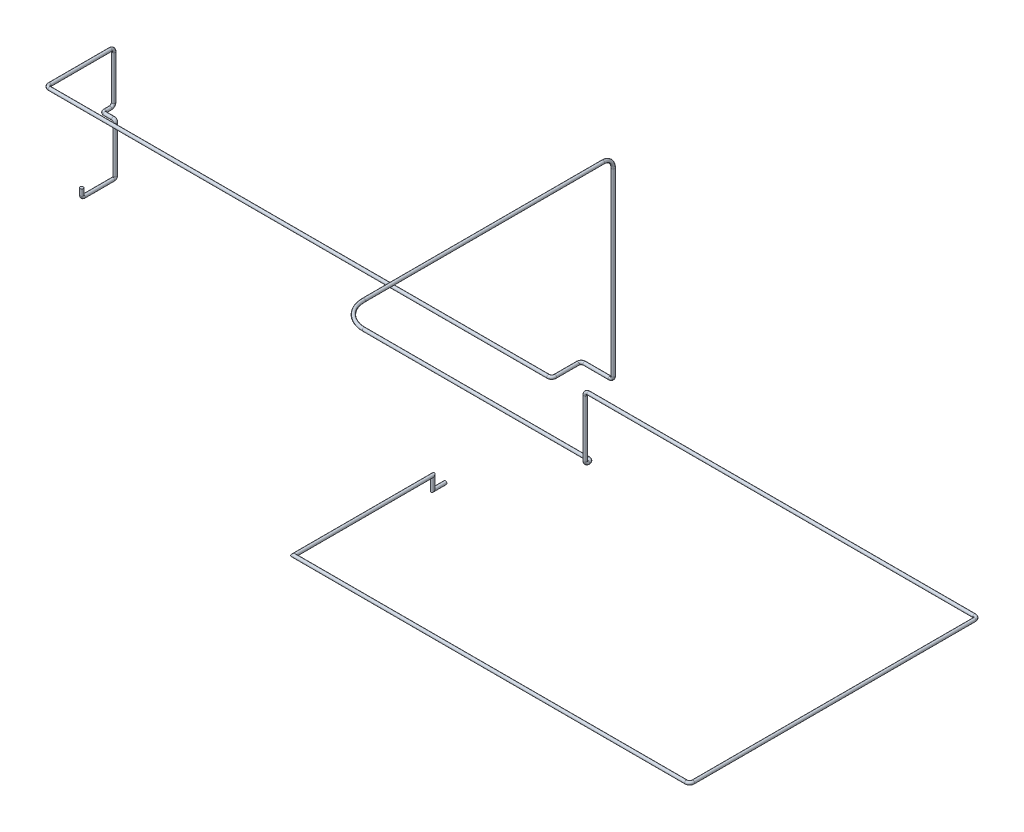
ISO-10303-21;
HEADER;
FILE_DESCRIPTION(('STEP AP214'),'2;1');
FILE_NAME('part.step','',(''),(''),'','','');
FILE_SCHEMA(('AUTOMOTIVE_DESIGN { 1 0 10303 214 1 1 1 1 }'));
ENDSEC;
DATA;
#1=APPLICATION_CONTEXT('core data for automotive mechanical design processes');
#2=APPLICATION_PROTOCOL_DEFINITION('international standard','automotive_design',2000,#1);
#3=PRODUCT_CONTEXT('',#1,'mechanical');
#4=PRODUCT('Part','Part','',(#3));
#5=PRODUCT_RELATED_PRODUCT_CATEGORY('part','',(#4));
#6=PRODUCT_DEFINITION_FORMATION('','',#4);
#7=PRODUCT_DEFINITION_CONTEXT('part definition',#1,'design');
#8=PRODUCT_DEFINITION('design','',#6,#7);
#9=PRODUCT_DEFINITION_SHAPE('','',#8);
#10=(LENGTH_UNIT() NAMED_UNIT(*) SI_UNIT(.MILLI.,.METRE.));
#11=(NAMED_UNIT(*) PLANE_ANGLE_UNIT() SI_UNIT($,.RADIAN.));
#12=(NAMED_UNIT(*) SI_UNIT($,.STERADIAN.) SOLID_ANGLE_UNIT());
#13=UNCERTAINTY_MEASURE_WITH_UNIT(LENGTH_MEASURE(1.E-05),#10,'distance_accuracy_value','');
#14=(GEOMETRIC_REPRESENTATION_CONTEXT(3) GLOBAL_UNCERTAINTY_ASSIGNED_CONTEXT((#13)) GLOBAL_UNIT_ASSIGNED_CONTEXT((#10,
#11,#12)) REPRESENTATION_CONTEXT('',''));
#15=CARTESIAN_POINT('',(0.,0.,0.));
#16=DIRECTION('',(0.,0.,1.));
#17=DIRECTION('',(1.,0.,0.));
#18=AXIS2_PLACEMENT_3D('',#15,#16,#17);
#19=CARTESIAN_POINT('',(0.,0.,-10.));
#20=DIRECTION('',(0.,0.,1.));
#21=DIRECTION('',(1.,0.,0.));
#22=AXIS2_PLACEMENT_3D('',#19,#20,#21);
#23=CYLINDRICAL_SURFACE('',#22,19.05);
#24=CARTESIAN_POINT('',(0.,0.,-30.));
#25=DIRECTION('',(0.,0.,-1.));
#26=DIRECTION('',(-1.,0.,0.));
#27=AXIS2_PLACEMENT_3D('',#24,#25,#26);
#28=CIRCLE('',#27,19.05);
#29=CARTESIAN_POINT('',(0.,-19.05,-30.));
#30=VERTEX_POINT('',#29);
#31=EDGE_CURVE('E11',#30,#30,#28,.T.);
#32=ORIENTED_EDGE('',*,*,#31,.F.);
#33=EDGE_LOOP('',(#32));
#34=FACE_BOUND('',#33,.T.);
#35=CARTESIAN_POINT('',(0.,0.,35.));
#36=DIRECTION('',(0.,0.,1.));
#37=DIRECTION('',(1.,0.,0.));
#38=AXIS2_PLACEMENT_3D('',#35,#36,#37);
#39=CIRCLE('',#38,19.05);
#40=CARTESIAN_POINT('',(-19.05,0.,35.));
#41=VERTEX_POINT('',#40);
#42=EDGE_CURVE('E323',#41,#41,#39,.T.);
#43=ORIENTED_EDGE('',*,*,#42,.F.);
#44=EDGE_LOOP('',(#43));
#45=FACE_BOUND('',#44,.T.);
#46=ADVANCED_FACE('F35',(#34,#45),#23,.T.);
#47=CARTESIAN_POINT('',(9340.,3500.,5332.));
#48=DIRECTION('',(0.,0.,-1.));
#49=DIRECTION('',(1.,0.,0.));
#50=AXIS2_PLACEMENT_3D('',#47,#48,#49);
#51=PLANE('',#50);
#52=CARTESIAN_POINT('',(9340.,3500.,5332.));
#53=DIRECTION('',(0.,0.,-1.));
#54=DIRECTION('',(1.,0.,0.));
#55=AXIS2_PLACEMENT_3D('',#52,#53,#54);
#56=CIRCLE('',#55,19.05);
#57=CARTESIAN_POINT('',(9359.05,3500.,5332.));
#58=VERTEX_POINT('',#57);
#59=EDGE_CURVE('E38',#58,#58,#56,.T.);
#60=ORIENTED_EDGE('',*,*,#59,.T.);
#61=EDGE_LOOP('',(#60));
#62=FACE_BOUND('',#61,.T.);
#63=ADVANCED_FACE('F167',(#62),#51,.T.);
#64=CARTESIAN_POINT('',(9340.,3500.,5524.01));
#65=DIRECTION('',(0.,0.,-1.));
#66=DIRECTION('',(-1.,0.,0.));
#67=AXIS2_PLACEMENT_3D('',#64,#65,#66);
#68=CYLINDRICAL_SURFACE('',#67,19.05);
#69=CARTESIAN_POINT('',(9340.,3500.,5482.));
#70=DIRECTION('',(0.,-0.707106781186547,-0.707106781186547));
#71=DIRECTION('',(0.,-0.707106781186548,0.707106781186548));
#72=AXIS2_PLACEMENT_3D('',#69,#70,#71);
#73=ELLIPSE('',#72,26.9407683632075,19.05);
#74=CARTESIAN_POINT('',(9340.,3480.95,5501.05));
#75=VERTEX_POINT('',#74);
#76=EDGE_CURVE('E53',#75,#75,#73,.F.);
#77=ORIENTED_EDGE('',*,*,#76,.F.);
#78=EDGE_LOOP('',(#77));
#79=FACE_BOUND('',#78,.T.);
#80=ORIENTED_EDGE('',*,*,#59,.F.);
#81=EDGE_LOOP('',(#80));
#82=FACE_BOUND('',#81,.T.);
#83=ADVANCED_FACE('F157',(#79,#82),#68,.T.);
#84=CARTESIAN_POINT('',(9340.,3692.01,5482.));
#85=DIRECTION('',(0.,-1.,0.));
#86=DIRECTION('',(0.,0.,-1.));
#87=AXIS2_PLACEMENT_3D('',#84,#85,#86);
#88=CYLINDRICAL_SURFACE('',#87,19.05);
#89=CARTESIAN_POINT('',(9340.,3650.,5482.));
#90=DIRECTION('',(0.,-0.707106781186548,-0.707106781186548));
#91=DIRECTION('',(0.,0.707106781186548,-0.707106781186548));
#92=AXIS2_PLACEMENT_3D('',#89,#90,#91);
#93=ELLIPSE('',#92,26.9407683632075,19.05);
#94=CARTESIAN_POINT('',(9340.,3669.05,5462.95));
#95=VERTEX_POINT('',#94);
#96=EDGE_CURVE('E151',#95,#95,#93,.F.);
#97=ORIENTED_EDGE('',*,*,#96,.F.);
#98=EDGE_LOOP('',(#97));
#99=FACE_BOUND('',#98,.T.);
#100=ORIENTED_EDGE('',*,*,#76,.T.);
#101=EDGE_LOOP('',(#100));
#102=FACE_BOUND('',#101,.T.);
#103=ADVANCED_FACE('F154',(#99,#102),#88,.T.);
#104=CARTESIAN_POINT('',(9340.,3650.,7153.055));
#105=DIRECTION('',(0.,0.,-1.));
#106=DIRECTION('',(-1.,0.,0.));
#107=AXIS2_PLACEMENT_3D('',#104,#105,#106);
#108=CYLINDRICAL_SURFACE('',#107,19.05);
#109=CARTESIAN_POINT('',(9340.,3650.,7132.));
#110=DIRECTION('',(-0.707106781186548,0.,-0.707106781186548));
#111=DIRECTION('',(-0.707106781186548,0.,0.707106781186548));
#112=AXIS2_PLACEMENT_3D('',#109,#110,#111);
#113=ELLIPSE('',#112,26.9407683632075,19.05);
#114=CARTESIAN_POINT('',(9320.95,3650.,7151.05));
#115=VERTEX_POINT('',#114);
#116=EDGE_CURVE('E78',#115,#115,#113,.F.);
#117=ORIENTED_EDGE('',*,*,#116,.F.);
#118=EDGE_LOOP('',(#117));
#119=FACE_BOUND('',#118,.T.);
#120=ORIENTED_EDGE('',*,*,#96,.T.);
#121=EDGE_LOOP('',(#120));
#122=FACE_BOUND('',#121,.T.);
#123=ADVANCED_FACE('F156',(#119,#122),#108,.T.);
#124=CARTESIAN_POINT('',(0.,40.,-30.));
#125=DIRECTION('',(1.,0.,0.));
#126=DIRECTION('',(0.,0.,-1.));
#127=AXIS2_PLACEMENT_3D('',#124,#125,#126);
#128=TOROIDAL_SURFACE('',#127,40.,19.05);
#129=CARTESIAN_POINT('',(0.,40.,-70.));
#130=DIRECTION('',(0.,1.,0.));
#131=DIRECTION('',(-1.,0.,0.));
#132=AXIS2_PLACEMENT_3D('',#129,#130,#131);
#133=CIRCLE('',#132,19.05);
#134=CARTESIAN_POINT('',(0.,40.,-89.05));
#135=VERTEX_POINT('',#134);
#136=EDGE_CURVE('E43',#135,#135,#133,.T.);
#137=CARTESIAN_POINT('',(0.,40.,-30.));
#138=DIRECTION('',(1.,0.,0.));
#139=DIRECTION('',(0.,0.,-1.));
#140=AXIS2_PLACEMENT_3D('',#137,#138,#139);
#141=CIRCLE('',#140,59.05);
#142=EDGE_CURVE('',#30,#135,#141,.T.);
#143=ORIENTED_EDGE('',*,*,#31,.T.);
#144=ORIENTED_EDGE('',*,*,#136,.F.);
#145=ORIENTED_EDGE('',*,*,#142,.T.);
#146=ORIENTED_EDGE('',*,*,#142,.F.);
#147=EDGE_LOOP('',(#143,#145,#144,#146));
#148=FACE_BOUND('',#147,.T.);
#149=ADVANCED_FACE('F164',(#148),#128,.T.);
#150=CARTESIAN_POINT('',(0.,40.,-70.));
#151=DIRECTION('',(0.,1.,0.));
#152=DIRECTION('',(0.,0.,1.));
#153=AXIS2_PLACEMENT_3D('',#150,#151,#152);
#154=CYLINDRICAL_SURFACE('',#153,19.05);
#155=CARTESIAN_POINT('',(0.,560.,-70.));
#156=DIRECTION('',(0.,1.,0.));
#157=DIRECTION('',(-1.,0.,0.));
#158=AXIS2_PLACEMENT_3D('',#155,#156,#157);
#159=CIRCLE('',#158,19.05);
#160=CARTESIAN_POINT('',(0.,560.,-89.05));
#161=VERTEX_POINT('',#160);
#162=EDGE_CURVE('E144',#161,#161,#159,.T.);
#163=ORIENTED_EDGE('',*,*,#162,.F.);
#164=EDGE_LOOP('',(#163));
#165=FACE_BOUND('',#164,.T.);
#166=ORIENTED_EDGE('',*,*,#136,.T.);
#167=EDGE_LOOP('',(#166));
#168=FACE_BOUND('',#167,.T.);
#169=ADVANCED_FACE('F195',(#165,#168),#154,.T.);
#170=CARTESIAN_POINT('',(0.,560.,-30.));
#171=DIRECTION('',(1.,0.,0.));
#172=DIRECTION('',(0.,0.,-1.));
#173=AXIS2_PLACEMENT_3D('',#170,#171,#172);
#174=TOROIDAL_SURFACE('',#173,40.,19.05);
#175=CARTESIAN_POINT('',(0.,600.,-30.));
#176=DIRECTION('',(0.,0.,1.));
#177=DIRECTION('',(-1.,0.,0.));
#178=AXIS2_PLACEMENT_3D('',#175,#176,#177);
#179=CIRCLE('',#178,19.05);
#180=CARTESIAN_POINT('',(0.,619.05,-30.));
#181=VERTEX_POINT('',#180);
#182=EDGE_CURVE('E141',#181,#181,#179,.T.);
#183=CARTESIAN_POINT('',(0.,560.,-30.));
#184=DIRECTION('',(1.,0.,0.));
#185=DIRECTION('',(0.,0.,-1.));
#186=AXIS2_PLACEMENT_3D('',#183,#184,#185);
#187=CIRCLE('',#186,59.05);
#188=EDGE_CURVE('',#161,#181,#187,.T.);
#189=ORIENTED_EDGE('',*,*,#162,.T.);
#190=ORIENTED_EDGE('',*,*,#182,.F.);
#191=ORIENTED_EDGE('',*,*,#188,.T.);
#192=ORIENTED_EDGE('',*,*,#188,.F.);
#193=EDGE_LOOP('',(#189,#191,#190,#192));
#194=FACE_BOUND('',#193,.T.);
#195=ADVANCED_FACE('F199',(#194),#174,.T.);
#196=CARTESIAN_POINT('',(0.,600.,-30.));
#197=DIRECTION('',(0.,0.,1.));
#198=DIRECTION('',(1.,0.,0.));
#199=AXIS2_PLACEMENT_3D('',#196,#197,#198);
#200=CYLINDRICAL_SURFACE('',#199,19.05);
#201=CARTESIAN_POINT('',(0.,600.,690.));
#202=DIRECTION('',(0.,0.,1.));
#203=DIRECTION('',(-1.,0.,0.));
#204=AXIS2_PLACEMENT_3D('',#201,#202,#203);
#205=CIRCLE('',#204,19.05);
#206=CARTESIAN_POINT('',(-19.05,600.,690.));
#207=VERTEX_POINT('',#206);
#208=EDGE_CURVE('E138',#207,#207,#205,.T.);
#209=ORIENTED_EDGE('',*,*,#208,.F.);
#210=EDGE_LOOP('',(#209));
#211=FACE_BOUND('',#210,.T.);
#212=ORIENTED_EDGE('',*,*,#182,.T.);
#213=EDGE_LOOP('',(#212));
#214=FACE_BOUND('',#213,.T.);
#215=ADVANCED_FACE('F203',(#211,#214),#200,.T.);
#216=CARTESIAN_POINT('',(40.,600.,690.));
#217=DIRECTION('',(0.,1.,0.));
#218=DIRECTION('',(0.,0.,1.));
#219=AXIS2_PLACEMENT_3D('',#216,#217,#218);
#220=TOROIDAL_SURFACE('',#219,40.,19.05);
#221=CARTESIAN_POINT('',(40.,600.,730.));
#222=DIRECTION('',(1.,0.,0.));
#223=DIRECTION('',(0.,0.,1.));
#224=AXIS2_PLACEMENT_3D('',#221,#222,#223);
#225=CIRCLE('',#224,19.05);
#226=CARTESIAN_POINT('',(40.,600.,749.05));
#227=VERTEX_POINT('',#226);
#228=EDGE_CURVE('E135',#227,#227,#225,.T.);
#229=CARTESIAN_POINT('',(40.,600.,690.));
#230=DIRECTION('',(0.,1.,0.));
#231=DIRECTION('',(0.,0.,1.));
#232=AXIS2_PLACEMENT_3D('',#229,#230,#231);
#233=CIRCLE('',#232,59.05);
#234=EDGE_CURVE('',#207,#227,#233,.T.);
#235=ORIENTED_EDGE('',*,*,#208,.T.);
#236=ORIENTED_EDGE('',*,*,#228,.F.);
#237=ORIENTED_EDGE('',*,*,#234,.T.);
#238=ORIENTED_EDGE('',*,*,#234,.F.);
#239=EDGE_LOOP('',(#235,#237,#236,#238));
#240=FACE_BOUND('',#239,.T.);
#241=ADVANCED_FACE('F207',(#240),#220,.T.);
#242=CARTESIAN_POINT('',(40.,600.,730.));
#243=DIRECTION('',(1.,0.,0.));
#244=DIRECTION('',(0.,0.,-1.));
#245=AXIS2_PLACEMENT_3D('',#242,#243,#244);
#246=CYLINDRICAL_SURFACE('',#245,19.05);
#247=CARTESIAN_POINT('',(5960.,600.,730.));
#248=DIRECTION('',(1.,0.,0.));
#249=DIRECTION('',(0.,0.,1.));
#250=AXIS2_PLACEMENT_3D('',#247,#248,#249);
#251=CIRCLE('',#250,19.05);
#252=CARTESIAN_POINT('',(5960.,600.,749.05));
#253=VERTEX_POINT('',#252);
#254=EDGE_CURVE('E132',#253,#253,#251,.T.);
#255=ORIENTED_EDGE('',*,*,#254,.F.);
#256=EDGE_LOOP('',(#255));
#257=FACE_BOUND('',#256,.T.);
#258=ORIENTED_EDGE('',*,*,#228,.T.);
#259=EDGE_LOOP('',(#258));
#260=FACE_BOUND('',#259,.T.);
#261=ADVANCED_FACE('F211',(#257,#260),#246,.T.);
#262=CARTESIAN_POINT('',(5960.,600.,690.));
#263=DIRECTION('',(0.,1.,0.));
#264=DIRECTION('',(0.,0.,1.));
#265=AXIS2_PLACEMENT_3D('',#262,#263,#264);
#266=TOROIDAL_SURFACE('',#265,40.,19.05);
#267=CARTESIAN_POINT('',(6000.,600.,690.));
#268=DIRECTION('',(0.,0.,-1.));
#269=DIRECTION('',(1.,0.,0.));
#270=AXIS2_PLACEMENT_3D('',#267,#268,#269);
#271=CIRCLE('',#270,19.05);
#272=CARTESIAN_POINT('',(6019.05,600.,690.));
#273=VERTEX_POINT('',#272);
#274=EDGE_CURVE('E129',#273,#273,#271,.T.);
#275=CARTESIAN_POINT('',(5960.,600.,690.));
#276=DIRECTION('',(0.,1.,0.));
#277=DIRECTION('',(0.,0.,1.));
#278=AXIS2_PLACEMENT_3D('',#275,#276,#277);
#279=CIRCLE('',#278,59.05);
#280=EDGE_CURVE('',#253,#273,#279,.T.);
#281=ORIENTED_EDGE('',*,*,#254,.T.);
#282=ORIENTED_EDGE('',*,*,#274,.F.);
#283=ORIENTED_EDGE('',*,*,#280,.T.);
#284=ORIENTED_EDGE('',*,*,#280,.F.);
#285=EDGE_LOOP('',(#281,#283,#282,#284));
#286=FACE_BOUND('',#285,.T.);
#287=ADVANCED_FACE('F215',(#286),#266,.T.);
#288=CARTESIAN_POINT('',(6000.,600.,690.));
#289=DIRECTION('',(0.,0.,-1.));
#290=DIRECTION('',(-1.,0.,0.));
#291=AXIS2_PLACEMENT_3D('',#288,#289,#290);
#292=CYLINDRICAL_SURFACE('',#291,19.05);
#293=CARTESIAN_POINT('',(6000.,600.,420.));
#294=DIRECTION('',(0.,0.,-1.));
#295=DIRECTION('',(1.,0.,0.));
#296=AXIS2_PLACEMENT_3D('',#293,#294,#295);
#297=CIRCLE('',#296,19.05);
#298=CARTESIAN_POINT('',(5980.95,600.,420.));
#299=VERTEX_POINT('',#298);
#300=EDGE_CURVE('E126',#299,#299,#297,.T.);
#301=ORIENTED_EDGE('',*,*,#300,.F.);
#302=EDGE_LOOP('',(#301));
#303=FACE_BOUND('',#302,.T.);
#304=ORIENTED_EDGE('',*,*,#274,.T.);
#305=EDGE_LOOP('',(#304));
#306=FACE_BOUND('',#305,.T.);
#307=ADVANCED_FACE('F219',(#303,#306),#292,.T.);
#308=CARTESIAN_POINT('',(6040.,600.,420.));
#309=DIRECTION('',(0.,-1.,0.));
#310=DIRECTION('',(0.,0.,-1.));
#311=AXIS2_PLACEMENT_3D('',#308,#309,#310);
#312=TOROIDAL_SURFACE('',#311,40.,19.05);
#313=CARTESIAN_POINT('',(6040.,600.,380.));
#314=DIRECTION('',(1.,0.,0.));
#315=DIRECTION('',(0.,0.,1.));
#316=AXIS2_PLACEMENT_3D('',#313,#314,#315);
#317=CIRCLE('',#316,19.05);
#318=CARTESIAN_POINT('',(6040.,600.,360.95));
#319=VERTEX_POINT('',#318);
#320=EDGE_CURVE('E123',#319,#319,#317,.T.);
#321=CARTESIAN_POINT('',(6040.,600.,420.));
#322=DIRECTION('',(0.,-1.,0.));
#323=DIRECTION('',(0.,0.,-1.));
#324=AXIS2_PLACEMENT_3D('',#321,#322,#323);
#325=CIRCLE('',#324,59.05);
#326=EDGE_CURVE('',#299,#319,#325,.T.);
#327=ORIENTED_EDGE('',*,*,#300,.T.);
#328=ORIENTED_EDGE('',*,*,#320,.F.);
#329=ORIENTED_EDGE('',*,*,#326,.T.);
#330=ORIENTED_EDGE('',*,*,#326,.F.);
#331=EDGE_LOOP('',(#327,#329,#328,#330));
#332=FACE_BOUND('',#331,.T.);
#333=ADVANCED_FACE('F223',(#332),#312,.T.);
#334=CARTESIAN_POINT('',(6040.,600.,380.));
#335=DIRECTION('',(1.,0.,0.));
#336=DIRECTION('',(0.,0.,-1.));
#337=AXIS2_PLACEMENT_3D('',#334,#335,#336);
#338=CYLINDRICAL_SURFACE('',#337,19.05);
#339=CARTESIAN_POINT('',(6340.,600.,380.));
#340=DIRECTION('',(1.,0.,0.));
#341=DIRECTION('',(0.,0.,1.));
#342=AXIS2_PLACEMENT_3D('',#339,#340,#341);
#343=CIRCLE('',#342,19.05);
#344=CARTESIAN_POINT('',(6340.,580.95,380.));
#345=VERTEX_POINT('',#344);
#346=EDGE_CURVE('E120',#345,#345,#343,.T.);
#347=ORIENTED_EDGE('',*,*,#346,.F.);
#348=EDGE_LOOP('',(#347));
#349=FACE_BOUND('',#348,.T.);
#350=ORIENTED_EDGE('',*,*,#320,.T.);
#351=EDGE_LOOP('',(#350));
#352=FACE_BOUND('',#351,.T.);
#353=ADVANCED_FACE('F227',(#349,#352),#338,.T.);
#354=CARTESIAN_POINT('',(6340.,640.,380.));
#355=DIRECTION('',(0.,0.,1.));
#356=DIRECTION('',(1.,0.,0.));
#357=AXIS2_PLACEMENT_3D('',#354,#355,#356);
#358=TOROIDAL_SURFACE('',#357,40.,19.05);
#359=CARTESIAN_POINT('',(6380.,640.,380.));
#360=DIRECTION('',(0.,1.,0.));
#361=DIRECTION('',(0.,0.,1.));
#362=AXIS2_PLACEMENT_3D('',#359,#360,#361);
#363=CIRCLE('',#362,19.05);
#364=CARTESIAN_POINT('',(6399.05,640.,380.));
#365=VERTEX_POINT('',#364);
#366=EDGE_CURVE('E117',#365,#365,#363,.T.);
#367=CARTESIAN_POINT('',(6340.,640.,380.));
#368=DIRECTION('',(0.,0.,1.));
#369=DIRECTION('',(1.,0.,0.));
#370=AXIS2_PLACEMENT_3D('',#367,#368,#369);
#371=CIRCLE('',#370,59.05);
#372=EDGE_CURVE('',#345,#365,#371,.T.);
#373=ORIENTED_EDGE('',*,*,#346,.T.);
#374=ORIENTED_EDGE('',*,*,#366,.F.);
#375=ORIENTED_EDGE('',*,*,#372,.T.);
#376=ORIENTED_EDGE('',*,*,#372,.F.);
#377=EDGE_LOOP('',(#373,#375,#374,#376));
#378=FACE_BOUND('',#377,.T.);
#379=ADVANCED_FACE('F231',(#378),#358,.T.);
#380=CARTESIAN_POINT('',(6380.,640.,380.));
#381=DIRECTION('',(0.,1.,0.));
#382=DIRECTION('',(0.,0.,1.));
#383=AXIS2_PLACEMENT_3D('',#380,#381,#382);
#384=CYLINDRICAL_SURFACE('',#383,19.05);
#385=CARTESIAN_POINT('',(6380.,2780.,380.));
#386=DIRECTION('',(0.,1.,0.));
#387=DIRECTION('',(0.,0.,1.));
#388=AXIS2_PLACEMENT_3D('',#385,#386,#387);
#389=CIRCLE('',#388,19.05);
#390=CARTESIAN_POINT('',(6380.,2780.,360.95));
#391=VERTEX_POINT('',#390);
#392=EDGE_CURVE('E114',#391,#391,#389,.T.);
#393=ORIENTED_EDGE('',*,*,#392,.F.);
#394=EDGE_LOOP('',(#393));
#395=FACE_BOUND('',#394,.T.);
#396=ORIENTED_EDGE('',*,*,#366,.T.);
#397=EDGE_LOOP('',(#396));
#398=FACE_BOUND('',#397,.T.);
#399=ADVANCED_FACE('F235',(#395,#398),#384,.T.);
#400=CARTESIAN_POINT('',(6380.,2780.,500.));
#401=DIRECTION('',(1.,0.,0.));
#402=DIRECTION('',(0.,0.,-1.));
#403=AXIS2_PLACEMENT_3D('',#400,#401,#402);
#404=TOROIDAL_SURFACE('',#403,120.,19.05);
#405=CARTESIAN_POINT('',(6380.,2900.,500.));
#406=DIRECTION('',(0.,0.,1.));
#407=DIRECTION('',(0.,-1.,0.));
#408=AXIS2_PLACEMENT_3D('',#405,#406,#407);
#409=CIRCLE('',#408,19.05);
#410=CARTESIAN_POINT('',(6380.,2919.05,500.));
#411=VERTEX_POINT('',#410);
#412=EDGE_CURVE('E111',#411,#411,#409,.T.);
#413=CARTESIAN_POINT('',(6380.,2780.,500.));
#414=DIRECTION('',(1.,0.,0.));
#415=DIRECTION('',(0.,0.,-1.));
#416=AXIS2_PLACEMENT_3D('',#413,#414,#415);
#417=CIRCLE('',#416,139.05);
#418=EDGE_CURVE('',#391,#411,#417,.T.);
#419=ORIENTED_EDGE('',*,*,#392,.T.);
#420=ORIENTED_EDGE('',*,*,#412,.F.);
#421=ORIENTED_EDGE('',*,*,#418,.T.);
#422=ORIENTED_EDGE('',*,*,#418,.F.);
#423=EDGE_LOOP('',(#419,#421,#420,#422));
#424=FACE_BOUND('',#423,.T.);
#425=ADVANCED_FACE('F239',(#424),#404,.T.);
#426=CARTESIAN_POINT('',(6380.,2900.,500.));
#427=DIRECTION('',(0.,0.,1.));
#428=DIRECTION('',(1.,0.,0.));
#429=AXIS2_PLACEMENT_3D('',#426,#427,#428);
#430=CYLINDRICAL_SURFACE('',#429,19.05);
#431=CARTESIAN_POINT('',(6380.,2900.,3340.));
#432=DIRECTION('',(0.,0.,1.));
#433=DIRECTION('',(0.,-1.,0.));
#434=AXIS2_PLACEMENT_3D('',#431,#432,#433);
#435=CIRCLE('',#434,19.05);
#436=CARTESIAN_POINT('',(6360.95,2900.,3340.));
#437=VERTEX_POINT('',#436);
#438=EDGE_CURVE('E108',#437,#437,#435,.T.);
#439=ORIENTED_EDGE('',*,*,#438,.F.);
#440=EDGE_LOOP('',(#439));
#441=FACE_BOUND('',#440,.T.);
#442=ORIENTED_EDGE('',*,*,#412,.T.);
#443=EDGE_LOOP('',(#442));
#444=FACE_BOUND('',#443,.T.);
#445=ADVANCED_FACE('F243',(#441,#444),#430,.T.);
#446=CARTESIAN_POINT('',(6680.,2900.,3340.));
#447=DIRECTION('',(0.,1.,0.));
#448=DIRECTION('',(0.,0.,1.));
#449=AXIS2_PLACEMENT_3D('',#446,#447,#448);
#450=TOROIDAL_SURFACE('',#449,300.,19.05);
#451=CARTESIAN_POINT('',(6680.,2900.,3640.));
#452=DIRECTION('',(1.,0.,0.));
#453=DIRECTION('',(0.,-1.,0.));
#454=AXIS2_PLACEMENT_3D('',#451,#452,#453);
#455=CIRCLE('',#454,19.05);
#456=CARTESIAN_POINT('',(6680.,2900.,3659.05));
#457=VERTEX_POINT('',#456);
#458=EDGE_CURVE('E105',#457,#457,#455,.T.);
#459=CARTESIAN_POINT('',(6680.,2900.,3340.));
#460=DIRECTION('',(0.,1.,0.));
#461=DIRECTION('',(0.,0.,1.));
#462=AXIS2_PLACEMENT_3D('',#459,#460,#461);
#463=CIRCLE('',#462,319.05);
#464=EDGE_CURVE('',#437,#457,#463,.T.);
#465=ORIENTED_EDGE('',*,*,#438,.T.);
#466=ORIENTED_EDGE('',*,*,#458,.F.);
#467=ORIENTED_EDGE('',*,*,#464,.T.);
#468=ORIENTED_EDGE('',*,*,#464,.F.);
#469=EDGE_LOOP('',(#465,#467,#466,#468));
#470=FACE_BOUND('',#469,.T.);
#471=ADVANCED_FACE('F247',(#470),#450,.T.);
#472=CARTESIAN_POINT('',(6680.,2900.,3640.));
#473=DIRECTION('',(1.,0.,0.));
#474=DIRECTION('',(0.,0.,-1.));
#475=AXIS2_PLACEMENT_3D('',#472,#473,#474);
#476=CYLINDRICAL_SURFACE('',#475,19.05);
#477=CARTESIAN_POINT('',(9345.,2900.,3640.));
#478=DIRECTION('',(1.,0.,0.));
#479=DIRECTION('',(0.,-1.,0.));
#480=AXIS2_PLACEMENT_3D('',#477,#478,#479);
#481=CIRCLE('',#480,19.05);
#482=CARTESIAN_POINT('',(9345.,2900.,3620.95));
#483=VERTEX_POINT('',#482);
#484=EDGE_CURVE('E102',#483,#483,#481,.T.);
#485=ORIENTED_EDGE('',*,*,#484,.F.);
#486=EDGE_LOOP('',(#485));
#487=FACE_BOUND('',#486,.T.);
#488=ORIENTED_EDGE('',*,*,#458,.T.);
#489=EDGE_LOOP('',(#488));
#490=FACE_BOUND('',#489,.T.);
#491=ADVANCED_FACE('F251',(#487,#490),#476,.T.);
#492=CARTESIAN_POINT('',(9345.,2900.,3675.));
#493=DIRECTION('',(0.,-1.,0.));
#494=DIRECTION('',(0.,0.,-1.));
#495=AXIS2_PLACEMENT_3D('',#492,#493,#494);
#496=TOROIDAL_SURFACE('',#495,35.0000000000001,19.05);
#497=CARTESIAN_POINT('',(9380.,2900.,3675.));
#498=DIRECTION('',(0.,0.,1.));
#499=DIRECTION('',(0.,-1.,0.));
#500=AXIS2_PLACEMENT_3D('',#497,#498,#499);
#501=CIRCLE('',#500,19.05);
#502=CARTESIAN_POINT('',(9399.05,2900.,3675.));
#503=VERTEX_POINT('',#502);
#504=EDGE_CURVE('E99',#503,#503,#501,.T.);
#505=CARTESIAN_POINT('',(9345.,2900.,3675.));
#506=DIRECTION('',(0.,-1.,0.));
#507=DIRECTION('',(0.,0.,-1.));
#508=AXIS2_PLACEMENT_3D('',#505,#506,#507);
#509=CIRCLE('',#508,54.0500000000001);
#510=EDGE_CURVE('',#483,#503,#509,.T.);
#511=ORIENTED_EDGE('',*,*,#484,.T.);
#512=ORIENTED_EDGE('',*,*,#504,.F.);
#513=ORIENTED_EDGE('',*,*,#510,.T.);
#514=ORIENTED_EDGE('',*,*,#510,.F.);
#515=EDGE_LOOP('',(#511,#513,#512,#514));
#516=FACE_BOUND('',#515,.T.);
#517=ADVANCED_FACE('F255',(#516),#496,.T.);
#518=CARTESIAN_POINT('',(9380.,2900.,3675.));
#519=DIRECTION('',(0.,0.,1.));
#520=DIRECTION('',(1.,0.,0.));
#521=AXIS2_PLACEMENT_3D('',#518,#519,#520);
#522=CYLINDRICAL_SURFACE('',#521,19.05);
#523=CARTESIAN_POINT('',(9380.,2900.,3677.));
#524=DIRECTION('',(0.,0.,1.));
#525=DIRECTION('',(0.,-1.,0.));
#526=AXIS2_PLACEMENT_3D('',#523,#524,#525);
#527=CIRCLE('',#526,19.05);
#528=CARTESIAN_POINT('',(9380.,2880.95,3677.));
#529=VERTEX_POINT('',#528);
#530=EDGE_CURVE('E96',#529,#529,#527,.T.);
#531=ORIENTED_EDGE('',*,*,#530,.F.);
#532=EDGE_LOOP('',(#531));
#533=FACE_BOUND('',#532,.T.);
#534=ORIENTED_EDGE('',*,*,#504,.T.);
#535=EDGE_LOOP('',(#534));
#536=FACE_BOUND('',#535,.T.);
#537=ADVANCED_FACE('F259',(#533,#536),#522,.T.);
#538=CARTESIAN_POINT('',(9380.,2935.,3677.));
#539=DIRECTION('',(-1.,0.,0.));
#540=DIRECTION('',(0.,0.,1.));
#541=AXIS2_PLACEMENT_3D('',#538,#539,#540);
#542=TOROIDAL_SURFACE('',#541,35.0000000000001,19.05);
#543=CARTESIAN_POINT('',(9380.,2935.,3712.));
#544=DIRECTION('',(0.,1.,0.));
#545=DIRECTION('',(0.,0.,1.));
#546=AXIS2_PLACEMENT_3D('',#543,#544,#545);
#547=CIRCLE('',#546,19.05);
#548=CARTESIAN_POINT('',(9380.,2935.,3731.05));
#549=VERTEX_POINT('',#548);
#550=EDGE_CURVE('E93',#549,#549,#547,.T.);
#551=CARTESIAN_POINT('',(9380.,2935.,3677.));
#552=DIRECTION('',(-1.,0.,0.));
#553=DIRECTION('',(0.,0.,1.));
#554=AXIS2_PLACEMENT_3D('',#551,#552,#553);
#555=CIRCLE('',#554,54.0500000000001);
#556=EDGE_CURVE('',#529,#549,#555,.T.);
#557=ORIENTED_EDGE('',*,*,#530,.T.);
#558=ORIENTED_EDGE('',*,*,#550,.F.);
#559=ORIENTED_EDGE('',*,*,#556,.T.);
#560=ORIENTED_EDGE('',*,*,#556,.F.);
#561=EDGE_LOOP('',(#557,#559,#558,#560));
#562=FACE_BOUND('',#561,.T.);
#563=ADVANCED_FACE('F263',(#562),#542,.T.);
#564=CARTESIAN_POINT('',(9380.,2935.,3712.));
#565=DIRECTION('',(0.,1.,0.));
#566=DIRECTION('',(0.,0.,1.));
#567=AXIS2_PLACEMENT_3D('',#564,#565,#566);
#568=CYLINDRICAL_SURFACE('',#567,19.05);
#569=CARTESIAN_POINT('',(9380.,3610.,3712.));
#570=DIRECTION('',(0.,1.,0.));
#571=DIRECTION('',(0.,0.,1.));
#572=AXIS2_PLACEMENT_3D('',#569,#570,#571);
#573=CIRCLE('',#572,19.05);
#574=CARTESIAN_POINT('',(9360.95,3610.,3712.));
#575=VERTEX_POINT('',#574);
#576=EDGE_CURVE('E90',#575,#575,#573,.T.);
#577=ORIENTED_EDGE('',*,*,#576,.F.);
#578=EDGE_LOOP('',(#577));
#579=FACE_BOUND('',#578,.T.);
#580=ORIENTED_EDGE('',*,*,#550,.T.);
#581=EDGE_LOOP('',(#580));
#582=FACE_BOUND('',#581,.T.);
#583=ADVANCED_FACE('F267',(#579,#582),#568,.T.);
#584=CARTESIAN_POINT('',(9420.,3610.,3712.));
#585=DIRECTION('',(0.,0.,-1.));
#586=DIRECTION('',(-1.,0.,0.));
#587=AXIS2_PLACEMENT_3D('',#584,#585,#586);
#588=TOROIDAL_SURFACE('',#587,39.9999999999991,19.05);
#589=CARTESIAN_POINT('',(9420.,3650.,3712.));
#590=DIRECTION('',(1.,0.,0.));
#591=DIRECTION('',(0.,0.,1.));
#592=AXIS2_PLACEMENT_3D('',#589,#590,#591);
#593=CIRCLE('',#592,19.05);
#594=CARTESIAN_POINT('',(9420.,3669.05,3712.));
#595=VERTEX_POINT('',#594);
#596=EDGE_CURVE('E87',#595,#595,#593,.T.);
#597=CARTESIAN_POINT('',(9420.,3610.,3712.));
#598=DIRECTION('',(0.,0.,-1.));
#599=DIRECTION('',(-1.,0.,0.));
#600=AXIS2_PLACEMENT_3D('',#597,#598,#599);
#601=CIRCLE('',#600,59.0499999999991);
#602=EDGE_CURVE('',#575,#595,#601,.T.);
#603=ORIENTED_EDGE('',*,*,#576,.T.);
#604=ORIENTED_EDGE('',*,*,#596,.F.);
#605=ORIENTED_EDGE('',*,*,#602,.T.);
#606=ORIENTED_EDGE('',*,*,#602,.F.);
#607=EDGE_LOOP('',(#603,#605,#604,#606));
#608=FACE_BOUND('',#607,.T.);
#609=ADVANCED_FACE('F271',(#608),#588,.T.);
#610=CARTESIAN_POINT('',(9420.,3650.,3712.));
#611=DIRECTION('',(1.,0.,0.));
#612=DIRECTION('',(0.,0.,-1.));
#613=AXIS2_PLACEMENT_3D('',#610,#611,#612);
#614=CYLINDRICAL_SURFACE('',#613,19.05);
#615=CARTESIAN_POINT('',(14000.,3650.,3712.));
#616=DIRECTION('',(1.,0.,0.));
#617=DIRECTION('',(0.,0.,1.));
#618=AXIS2_PLACEMENT_3D('',#615,#616,#617);
#619=CIRCLE('',#618,19.05);
#620=CARTESIAN_POINT('',(14000.,3650.,3692.95));
#621=VERTEX_POINT('',#620);
#622=EDGE_CURVE('E84',#621,#621,#619,.T.);
#623=ORIENTED_EDGE('',*,*,#622,.F.);
#624=EDGE_LOOP('',(#623));
#625=FACE_BOUND('',#624,.T.);
#626=ORIENTED_EDGE('',*,*,#596,.T.);
#627=EDGE_LOOP('',(#626));
#628=FACE_BOUND('',#627,.T.);
#629=ADVANCED_FACE('F275',(#625,#628),#614,.T.);
#630=CARTESIAN_POINT('',(14000.,3650.,3752.));
#631=DIRECTION('',(0.,-1.,0.));
#632=DIRECTION('',(0.,0.,-1.));
#633=AXIS2_PLACEMENT_3D('',#630,#631,#632);
#634=TOROIDAL_SURFACE('',#633,39.9999999999996,19.05);
#635=CARTESIAN_POINT('',(14040.,3650.,3752.));
#636=DIRECTION('',(0.,0.,1.));
#637=DIRECTION('',(-1.,0.,0.));
#638=AXIS2_PLACEMENT_3D('',#635,#636,#637);
#639=CIRCLE('',#638,19.05);
#640=CARTESIAN_POINT('',(14059.05,3650.,3752.));
#641=VERTEX_POINT('',#640);
#642=EDGE_CURVE('E81',#641,#641,#639,.T.);
#643=CARTESIAN_POINT('',(14000.,3650.,3752.));
#644=DIRECTION('',(0.,-1.,0.));
#645=DIRECTION('',(0.,0.,-1.));
#646=AXIS2_PLACEMENT_3D('',#643,#644,#645);
#647=CIRCLE('',#646,59.0499999999996);
#648=EDGE_CURVE('',#621,#641,#647,.T.);
#649=ORIENTED_EDGE('',*,*,#622,.T.);
#650=ORIENTED_EDGE('',*,*,#642,.F.);
#651=ORIENTED_EDGE('',*,*,#648,.T.);
#652=ORIENTED_EDGE('',*,*,#648,.F.);
#653=EDGE_LOOP('',(#649,#651,#650,#652));
#654=FACE_BOUND('',#653,.T.);
#655=ADVANCED_FACE('F279',(#654),#634,.T.);
#656=CARTESIAN_POINT('',(14040.,3650.,3752.));
#657=DIRECTION('',(0.,0.,1.));
#658=DIRECTION('',(1.,0.,0.));
#659=AXIS2_PLACEMENT_3D('',#656,#657,#658);
#660=CYLINDRICAL_SURFACE('',#659,19.05);
#661=CARTESIAN_POINT('',(14040.,3650.,7092.));
#662=DIRECTION('',(0.,0.,1.));
#663=DIRECTION('',(-1.,0.,0.));
#664=AXIS2_PLACEMENT_3D('',#661,#662,#663);
#665=CIRCLE('',#664,19.05);
#666=CARTESIAN_POINT('',(14059.05,3650.,7092.));
#667=VERTEX_POINT('',#666);
#668=EDGE_CURVE('E77',#667,#667,#665,.T.);
#669=ORIENTED_EDGE('',*,*,#668,.F.);
#670=EDGE_LOOP('',(#669));
#671=FACE_BOUND('',#670,.T.);
#672=ORIENTED_EDGE('',*,*,#642,.T.);
#673=EDGE_LOOP('',(#672));
#674=FACE_BOUND('',#673,.T.);
#675=ADVANCED_FACE('F188',(#671,#674),#660,.T.);
#676=CARTESIAN_POINT('',(14000.,3650.,7092.));
#677=DIRECTION('',(0.,-1.,0.));
#678=DIRECTION('',(0.,0.,-1.));
#679=AXIS2_PLACEMENT_3D('',#676,#677,#678);
#680=TOROIDAL_SURFACE('',#679,39.9999999999991,19.05);
#681=CARTESIAN_POINT('',(14000.,3650.,7132.));
#682=DIRECTION('',(-1.,0.,0.));
#683=DIRECTION('',(0.,0.,-1.));
#684=AXIS2_PLACEMENT_3D('',#681,#682,#683);
#685=CIRCLE('',#684,19.05);
#686=CARTESIAN_POINT('',(14000.,3650.,7151.05));
#687=VERTEX_POINT('',#686);
#688=EDGE_CURVE('E74',#687,#687,#685,.T.);
#689=CARTESIAN_POINT('',(14000.,3650.,7092.));
#690=DIRECTION('',(0.,-1.,0.));
#691=DIRECTION('',(0.,0.,-1.));
#692=AXIS2_PLACEMENT_3D('',#689,#690,#691);
#693=CIRCLE('',#692,59.0499999999991);
#694=EDGE_CURVE('',#667,#687,#693,.T.);
#695=ORIENTED_EDGE('',*,*,#668,.T.);
#696=ORIENTED_EDGE('',*,*,#688,.F.);
#697=ORIENTED_EDGE('',*,*,#694,.T.);
#698=ORIENTED_EDGE('',*,*,#694,.F.);
#699=EDGE_LOOP('',(#695,#697,#696,#698));
#700=FACE_BOUND('',#699,.T.);
#701=ADVANCED_FACE('F179',(#700),#680,.T.);
#702=CARTESIAN_POINT('',(14000.,3650.,7132.));
#703=DIRECTION('',(-1.,0.,0.));
#704=DIRECTION('',(0.,0.,1.));
#705=AXIS2_PLACEMENT_3D('',#702,#703,#704);
#706=CYLINDRICAL_SURFACE('',#705,19.05);
#707=ORIENTED_EDGE('',*,*,#688,.T.);
#708=EDGE_LOOP('',(#707));
#709=FACE_BOUND('',#708,.T.);
#710=ORIENTED_EDGE('',*,*,#116,.T.);
#711=EDGE_LOOP('',(#710));
#712=FACE_BOUND('',#711,.T.);
#713=ADVANCED_FACE('F171',(#709,#712),#706,.T.);
#714=CARTESIAN_POINT('',(150.,-500.,460.));
#715=DIRECTION('',(0.,1.,0.));
#716=DIRECTION('',(0.,0.,1.));
#717=AXIS2_PLACEMENT_3D('',#714,#715,#716);
#718=PLANE('',#717);
#719=CARTESIAN_POINT('',(150.,-500.,460.));
#720=DIRECTION('',(0.,1.,0.));
#721=DIRECTION('',(0.,0.,1.));
#722=AXIS2_PLACEMENT_3D('',#719,#720,#721);
#723=CIRCLE('',#722,19.05);
#724=CARTESIAN_POINT('',(150.,-500.,479.05));
#725=VERTEX_POINT('',#724);
#726=EDGE_CURVE('E64',#725,#725,#723,.T.);
#727=ORIENTED_EDGE('',*,*,#726,.T.);
#728=EDGE_LOOP('',(#727));
#729=FACE_BOUND('',#728,.T.);
#730=ADVANCED_FACE('F65',(#729),#718,.T.);
#731=CARTESIAN_POINT('',(25.,0.,35.));
#732=DIRECTION('',(0.,1.,0.));
#733=DIRECTION('',(0.,0.,1.));
#734=AXIS2_PLACEMENT_3D('',#731,#732,#733);
#735=TOROIDAL_SURFACE('',#734,25.,19.05);
#736=CARTESIAN_POINT('',(25.,0.,60.));
#737=DIRECTION('',(1.,0.,0.));
#738=DIRECTION('',(0.,0.,-1.));
#739=AXIS2_PLACEMENT_3D('',#736,#737,#738);
#740=CIRCLE('',#739,19.05);
#741=CARTESIAN_POINT('',(25.,0.,79.05));
#742=VERTEX_POINT('',#741);
#743=EDGE_CURVE('E320',#742,#742,#740,.T.);
#744=CARTESIAN_POINT('',(25.,0.,35.));
#745=DIRECTION('',(0.,1.,0.));
#746=DIRECTION('',(0.,0.,1.));
#747=AXIS2_PLACEMENT_3D('',#744,#745,#746);
#748=CIRCLE('',#747,44.05);
#749=EDGE_CURVE('',#41,#742,#748,.T.);
#750=ORIENTED_EDGE('',*,*,#42,.T.);
#751=ORIENTED_EDGE('',*,*,#743,.F.);
#752=ORIENTED_EDGE('',*,*,#749,.T.);
#753=ORIENTED_EDGE('',*,*,#749,.F.);
#754=EDGE_LOOP('',(#750,#752,#751,#753));
#755=FACE_BOUND('',#754,.T.);
#756=ADVANCED_FACE('F186',(#755),#735,.T.);
#757=CARTESIAN_POINT('',(25.,0.,60.));
#758=DIRECTION('',(1.,0.,0.));
#759=DIRECTION('',(0.,0.,-1.));
#760=AXIS2_PLACEMENT_3D('',#757,#758,#759);
#761=CYLINDRICAL_SURFACE('',#760,19.05);
#762=CARTESIAN_POINT('',(125.,0.,60.));
#763=DIRECTION('',(1.,0.,0.));
#764=DIRECTION('',(0.,0.,-1.));
#765=AXIS2_PLACEMENT_3D('',#762,#763,#764);
#766=CIRCLE('',#765,19.05);
#767=CARTESIAN_POINT('',(125.,19.05,60.));
#768=VERTEX_POINT('',#767);
#769=EDGE_CURVE('E325',#768,#768,#766,.T.);
#770=ORIENTED_EDGE('',*,*,#769,.F.);
#771=EDGE_LOOP('',(#770));
#772=FACE_BOUND('',#771,.T.);
#773=ORIENTED_EDGE('',*,*,#743,.T.);
#774=EDGE_LOOP('',(#773));
#775=FACE_BOUND('',#774,.T.);
#776=ADVANCED_FACE('F308',(#772,#775),#761,.T.);
#777=CARTESIAN_POINT('',(125.,-25.,60.));
#778=DIRECTION('',(0.,0.,-1.));
#779=DIRECTION('',(-1.,0.,0.));
#780=AXIS2_PLACEMENT_3D('',#777,#778,#779);
#781=TOROIDAL_SURFACE('',#780,25.,19.05);
#782=CARTESIAN_POINT('',(150.,-25.,60.));
#783=DIRECTION('',(0.,-1.,0.));
#784=DIRECTION('',(0.,0.,-1.));
#785=AXIS2_PLACEMENT_3D('',#782,#783,#784);
#786=CIRCLE('',#785,19.05);
#787=CARTESIAN_POINT('',(169.05,-25.,60.));
#788=VERTEX_POINT('',#787);
#789=EDGE_CURVE('E330',#788,#788,#786,.T.);
#790=CARTESIAN_POINT('',(125.,-25.,60.));
#791=DIRECTION('',(0.,0.,-1.));
#792=DIRECTION('',(-1.,0.,0.));
#793=AXIS2_PLACEMENT_3D('',#790,#791,#792);
#794=CIRCLE('',#793,44.05);
#795=EDGE_CURVE('',#768,#788,#794,.T.);
#796=ORIENTED_EDGE('',*,*,#769,.T.);
#797=ORIENTED_EDGE('',*,*,#789,.F.);
#798=ORIENTED_EDGE('',*,*,#795,.T.);
#799=ORIENTED_EDGE('',*,*,#795,.F.);
#800=EDGE_LOOP('',(#796,#798,#797,#799));
#801=FACE_BOUND('',#800,.T.);
#802=ADVANCED_FACE('F304',(#801),#781,.T.);
#803=CARTESIAN_POINT('',(150.,-25.,60.));
#804=DIRECTION('',(0.,-1.,0.));
#805=DIRECTION('',(0.,0.,-1.));
#806=AXIS2_PLACEMENT_3D('',#803,#804,#805);
#807=CYLINDRICAL_SURFACE('',#806,19.05);
#808=CARTESIAN_POINT('',(150.,-575.,60.));
#809=DIRECTION('',(0.,-1.,0.));
#810=DIRECTION('',(0.,0.,-1.));
#811=AXIS2_PLACEMENT_3D('',#808,#809,#810);
#812=CIRCLE('',#811,19.05);
#813=CARTESIAN_POINT('',(150.,-575.,40.95));
#814=VERTEX_POINT('',#813);
#815=EDGE_CURVE('E333',#814,#814,#812,.T.);
#816=ORIENTED_EDGE('',*,*,#815,.F.);
#817=EDGE_LOOP('',(#816));
#818=FACE_BOUND('',#817,.T.);
#819=ORIENTED_EDGE('',*,*,#789,.T.);
#820=EDGE_LOOP('',(#819));
#821=FACE_BOUND('',#820,.T.);
#822=ADVANCED_FACE('F300',(#818,#821),#807,.T.);
#823=CARTESIAN_POINT('',(150.,-575.,85.));
#824=DIRECTION('',(-1.,0.,0.));
#825=DIRECTION('',(0.,0.,1.));
#826=AXIS2_PLACEMENT_3D('',#823,#824,#825);
#827=TOROIDAL_SURFACE('',#826,25.,19.05);
#828=CARTESIAN_POINT('',(150.,-600.,85.));
#829=DIRECTION('',(0.,0.,1.));
#830=DIRECTION('',(0.,-1.,0.));
#831=AXIS2_PLACEMENT_3D('',#828,#829,#830);
#832=CIRCLE('',#831,19.05);
#833=CARTESIAN_POINT('',(150.,-619.05,85.));
#834=VERTEX_POINT('',#833);
#835=EDGE_CURVE('E336',#834,#834,#832,.T.);
#836=CARTESIAN_POINT('',(150.,-575.,85.));
#837=DIRECTION('',(-1.,0.,0.));
#838=DIRECTION('',(0.,0.,1.));
#839=AXIS2_PLACEMENT_3D('',#836,#837,#838);
#840=CIRCLE('',#839,44.05);
#841=EDGE_CURVE('',#814,#834,#840,.T.);
#842=ORIENTED_EDGE('',*,*,#815,.T.);
#843=ORIENTED_EDGE('',*,*,#835,.F.);
#844=ORIENTED_EDGE('',*,*,#841,.T.);
#845=ORIENTED_EDGE('',*,*,#841,.F.);
#846=EDGE_LOOP('',(#842,#844,#843,#845));
#847=FACE_BOUND('',#846,.T.);
#848=ADVANCED_FACE('F296',(#847),#827,.T.);
#849=CARTESIAN_POINT('',(150.,-600.,85.));
#850=DIRECTION('',(0.,0.,1.));
#851=DIRECTION('',(1.,0.,0.));
#852=AXIS2_PLACEMENT_3D('',#849,#850,#851);
#853=CYLINDRICAL_SURFACE('',#852,19.05);
#854=CARTESIAN_POINT('',(150.,-600.,435.));
#855=DIRECTION('',(0.,0.,1.));
#856=DIRECTION('',(0.,-1.,0.));
#857=AXIS2_PLACEMENT_3D('',#854,#855,#856);
#858=CIRCLE('',#857,19.05);
#859=CARTESIAN_POINT('',(150.,-619.05,435.));
#860=VERTEX_POINT('',#859);
#861=EDGE_CURVE('E70',#860,#860,#858,.T.);
#862=ORIENTED_EDGE('',*,*,#861,.F.);
#863=EDGE_LOOP('',(#862));
#864=FACE_BOUND('',#863,.T.);
#865=ORIENTED_EDGE('',*,*,#835,.T.);
#866=EDGE_LOOP('',(#865));
#867=FACE_BOUND('',#866,.T.);
#868=ADVANCED_FACE('F292',(#864,#867),#853,.T.);
#869=CARTESIAN_POINT('',(150.,-575.,435.));
#870=DIRECTION('',(-1.,0.,0.));
#871=DIRECTION('',(0.,0.,1.));
#872=AXIS2_PLACEMENT_3D('',#869,#870,#871);
#873=TOROIDAL_SURFACE('',#872,25.,19.05);
#874=CARTESIAN_POINT('',(150.,-575.,460.));
#875=DIRECTION('',(0.,1.,0.));
#876=DIRECTION('',(0.,0.,1.));
#877=AXIS2_PLACEMENT_3D('',#874,#875,#876);
#878=CIRCLE('',#877,19.05);
#879=CARTESIAN_POINT('',(150.,-575.,479.05));
#880=VERTEX_POINT('',#879);
#881=EDGE_CURVE('E67',#880,#880,#878,.T.);
#882=CARTESIAN_POINT('',(150.,-575.,435.));
#883=DIRECTION('',(-1.,0.,0.));
#884=DIRECTION('',(0.,0.,1.));
#885=AXIS2_PLACEMENT_3D('',#882,#883,#884);
#886=CIRCLE('',#885,44.05);
#887=EDGE_CURVE('',#860,#880,#886,.T.);
#888=ORIENTED_EDGE('',*,*,#861,.T.);
#889=ORIENTED_EDGE('',*,*,#881,.F.);
#890=ORIENTED_EDGE('',*,*,#887,.T.);
#891=ORIENTED_EDGE('',*,*,#887,.F.);
#892=EDGE_LOOP('',(#888,#890,#889,#891));
#893=FACE_BOUND('',#892,.T.);
#894=ADVANCED_FACE('F289',(#893),#873,.T.);
#895=CARTESIAN_POINT('',(150.,-575.,460.));
#896=DIRECTION('',(0.,1.,0.));
#897=DIRECTION('',(0.,0.,1.));
#898=AXIS2_PLACEMENT_3D('',#895,#896,#897);
#899=CYLINDRICAL_SURFACE('',#898,19.05);
#900=ORIENTED_EDGE('',*,*,#726,.F.);
#901=EDGE_LOOP('',(#900));
#902=FACE_BOUND('',#901,.T.);
#903=ORIENTED_EDGE('',*,*,#881,.T.);
#904=EDGE_LOOP('',(#903));
#905=FACE_BOUND('',#904,.T.);
#906=ADVANCED_FACE('F175',(#902,#905),#899,.T.);
#907=CLOSED_SHELL('',(#46,#63,#83,#103,#123,#149,#169,#195,#215,#241,#261,#287,#307,#333,#353,
#379,#399,#425,#445,#471,#491,#517,#537,#563,#583,#609,#629,#655,#675,#701,#713,#730,#756,#776,
#802,#822,#848,#868,#894,#906));
#908=MANIFOLD_SOLID_BREP('B2',#907);
#909=ADVANCED_BREP_SHAPE_REPRESENTATION('',(#18,#908),#14);
#910=SHAPE_DEFINITION_REPRESENTATION(#9,#909);
ENDSEC;
END-ISO-10303-21;
